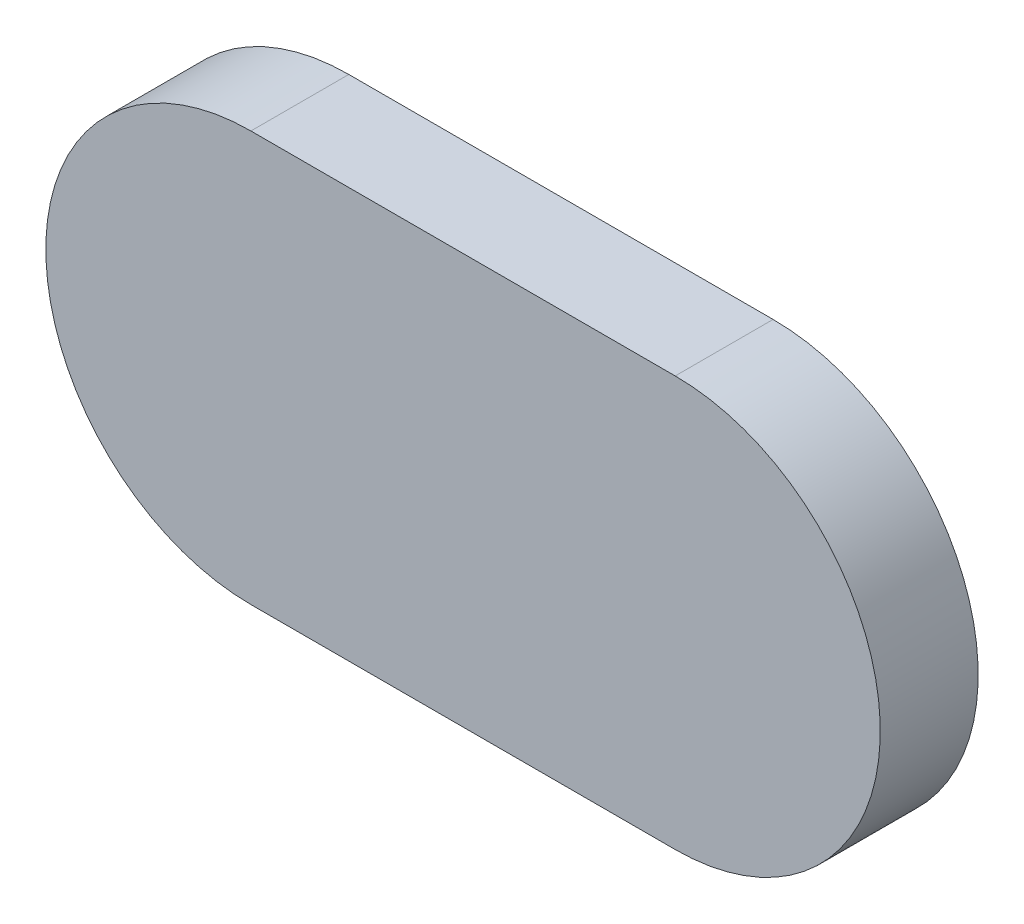
ISO-10303-21;
HEADER;
FILE_DESCRIPTION(('STEP AP214'),'2;1');
FILE_NAME('part.step','',(''),(''),'','','');
FILE_SCHEMA(('AUTOMOTIVE_DESIGN { 1 0 10303 214 1 1 1 1 }'));
ENDSEC;
DATA;
#1=APPLICATION_CONTEXT('core data for automotive mechanical design processes');
#2=APPLICATION_PROTOCOL_DEFINITION('international standard','automotive_design',2000,#1);
#3=PRODUCT_CONTEXT('',#1,'mechanical');
#4=PRODUCT('Part','Part','',(#3));
#5=PRODUCT_RELATED_PRODUCT_CATEGORY('part','',(#4));
#6=PRODUCT_DEFINITION_FORMATION('','',#4);
#7=PRODUCT_DEFINITION_CONTEXT('part definition',#1,'design');
#8=PRODUCT_DEFINITION('design','',#6,#7);
#9=PRODUCT_DEFINITION_SHAPE('','',#8);
#10=(LENGTH_UNIT() NAMED_UNIT(*) SI_UNIT(.MILLI.,.METRE.));
#11=(NAMED_UNIT(*) PLANE_ANGLE_UNIT() SI_UNIT($,.RADIAN.));
#12=(NAMED_UNIT(*) SI_UNIT($,.STERADIAN.) SOLID_ANGLE_UNIT());
#13=UNCERTAINTY_MEASURE_WITH_UNIT(LENGTH_MEASURE(1.E-05),#10,'distance_accuracy_value','');
#14=(GEOMETRIC_REPRESENTATION_CONTEXT(3) GLOBAL_UNCERTAINTY_ASSIGNED_CONTEXT((#13)) GLOBAL_UNIT_ASSIGNED_CONTEXT((#10,
#11,#12)) REPRESENTATION_CONTEXT('',''));
#15=CARTESIAN_POINT('',(0.,0.,0.));
#16=DIRECTION('',(0.,0.,1.));
#17=DIRECTION('',(1.,0.,0.));
#18=AXIS2_PLACEMENT_3D('',#15,#16,#17);
#19=CARTESIAN_POINT('',(-75.,0.904270006017976,0.));
#20=DIRECTION('',(0.,0.,1.));
#21=DIRECTION('',(1.,0.,0.));
#22=AXIS2_PLACEMENT_3D('',#19,#20,#21);
#23=PLANE('',#22);
#24=CARTESIAN_POINT('',(-75.,0.904270006017976,0.));
#25=DIRECTION('',(0.,0.,1.));
#26=DIRECTION('',(1.,0.,0.));
#27=AXIS2_PLACEMENT_3D('',#24,#25,#26);
#28=CIRCLE('',#27,72.5);
#29=CARTESIAN_POINT('',(-75.,73.4042700060163,0.));
#30=VERTEX_POINT('',#29);
#31=CARTESIAN_POINT('',(-75.,-71.595729993982,0.));
#32=VERTEX_POINT('',#31);
#33=EDGE_CURVE('E118',#30,#32,#28,.T.);
#34=ORIENTED_EDGE('',*,*,#33,.F.);
#35=DIRECTION('',(1.,0.,0.));
#36=VECTOR('',#35,1.);
#37=CARTESIAN_POINT('',(-75.,73.4042700060163,0.));
#38=LINE('',#37,#36);
#39=CARTESIAN_POINT('',(75.,73.4042700060163,0.));
#40=VERTEX_POINT('',#39);
#41=EDGE_CURVE('E121',#30,#40,#38,.T.);
#42=ORIENTED_EDGE('',*,*,#41,.T.);
#43=CARTESIAN_POINT('',(75.,0.904270006016422,0.));
#44=DIRECTION('',(0.,0.,1.));
#45=DIRECTION('',(1.,0.,0.));
#46=AXIS2_PLACEMENT_3D('',#43,#44,#45);
#47=CIRCLE('',#46,72.5);
#48=CARTESIAN_POINT('',(75.,-71.5957299939835,0.));
#49=VERTEX_POINT('',#48);
#50=EDGE_CURVE('E119',#49,#40,#47,.T.);
#51=ORIENTED_EDGE('',*,*,#50,.F.);
#52=DIRECTION('',(1.,0.,0.));
#53=VECTOR('',#52,1.);
#54=CARTESIAN_POINT('',(-75.,-71.595729993982,0.));
#55=LINE('',#54,#53);
#56=EDGE_CURVE('E67',#32,#49,#55,.T.);
#57=ORIENTED_EDGE('',*,*,#56,.F.);
#58=EDGE_LOOP('',(#34,#42,#51,#57));
#59=FACE_BOUND('',#58,.T.);
#60=ADVANCED_FACE('F63',(#59),#23,.F.);
#61=CARTESIAN_POINT('',(-75.,0.904270006017976,34.6094334021139));
#62=DIRECTION('',(0.,0.,1.));
#63=DIRECTION('',(1.,0.,0.));
#64=AXIS2_PLACEMENT_3D('',#61,#62,#63);
#65=PLANE('',#64);
#66=CARTESIAN_POINT('',(-75.,0.904270006017976,34.6094334021139));
#67=DIRECTION('',(0.,0.,1.));
#68=DIRECTION('',(1.,0.,0.));
#69=AXIS2_PLACEMENT_3D('',#66,#67,#68);
#70=CIRCLE('',#69,72.5);
#71=CARTESIAN_POINT('',(-75.,73.404270006018,34.6094334021139));
#72=VERTEX_POINT('',#71);
#73=CARTESIAN_POINT('',(-75.,-71.595729993982,34.6094334021139));
#74=VERTEX_POINT('',#73);
#75=EDGE_CURVE('E113',#72,#74,#70,.T.);
#76=ORIENTED_EDGE('',*,*,#75,.T.);
#77=DIRECTION('',(1.,0.,0.));
#78=VECTOR('',#77,1.);
#79=CARTESIAN_POINT('',(-75.,-71.595729993982,34.6094334021139));
#80=LINE('',#79,#78);
#81=CARTESIAN_POINT('',(75.,-71.5957299939835,34.6094334021139));
#82=VERTEX_POINT('',#81);
#83=EDGE_CURVE('E111',#74,#82,#80,.T.);
#84=ORIENTED_EDGE('',*,*,#83,.T.);
#85=CARTESIAN_POINT('',(75.,0.904270006016422,34.6094334021139));
#86=DIRECTION('',(0.,0.,1.));
#87=DIRECTION('',(1.,0.,0.));
#88=AXIS2_PLACEMENT_3D('',#85,#86,#87);
#89=CIRCLE('',#88,72.5);
#90=CARTESIAN_POINT('',(75.,73.4042700060163,34.6094334021139));
#91=VERTEX_POINT('',#90);
#92=EDGE_CURVE('E127',#82,#91,#89,.T.);
#93=ORIENTED_EDGE('',*,*,#92,.T.);
#94=DIRECTION('',(1.,0.,0.));
#95=VECTOR('',#94,1.);
#96=CARTESIAN_POINT('',(-75.,73.4042700060163,34.6094334021139));
#97=LINE('',#96,#95);
#98=EDGE_CURVE('E120',#72,#91,#97,.T.);
#99=ORIENTED_EDGE('',*,*,#98,.F.);
#100=EDGE_LOOP('',(#76,#84,#93,#99));
#101=FACE_BOUND('',#100,.T.);
#102=ADVANCED_FACE('F137',(#101),#65,.T.);
#103=CARTESIAN_POINT('',(-75.,0.904270006017976,34.6094334021139));
#104=DIRECTION('',(0.,0.,-1.));
#105=DIRECTION('',(-1.,0.,0.));
#106=AXIS2_PLACEMENT_3D('',#103,#104,#105);
#107=CYLINDRICAL_SURFACE('',#106,72.5);
#108=ORIENTED_EDGE('',*,*,#75,.F.);
#109=DIRECTION('',(0.,0.,-1.));
#110=VECTOR('',#109,1.);
#111=CARTESIAN_POINT('',(-75.,73.404270006018,34.6094334021139));
#112=LINE('',#111,#110);
#113=EDGE_CURVE('E12',#72,#30,#112,.T.);
#114=ORIENTED_EDGE('',*,*,#113,.T.);
#115=ORIENTED_EDGE('',*,*,#33,.T.);
#116=DIRECTION('',(0.,0.,-1.));
#117=VECTOR('',#116,1.);
#118=CARTESIAN_POINT('',(-75.,-71.595729993982,34.6094334021139));
#119=LINE('',#118,#117);
#120=EDGE_CURVE('E73',#74,#32,#119,.T.);
#121=ORIENTED_EDGE('',*,*,#120,.F.);
#122=EDGE_LOOP('',(#108,#114,#115,#121));
#123=FACE_BOUND('',#122,.T.);
#124=ADVANCED_FACE('F122',(#123),#107,.T.);
#125=CARTESIAN_POINT('',(75.,0.904270006016422,34.6094334021139));
#126=DIRECTION('',(0.,0.,-1.));
#127=DIRECTION('',(-1.,0.,0.));
#128=AXIS2_PLACEMENT_3D('',#125,#126,#127);
#129=CYLINDRICAL_SURFACE('',#128,72.5);
#130=DIRECTION('',(0.,0.,-1.));
#131=VECTOR('',#130,1.);
#132=CARTESIAN_POINT('',(75.,-71.5957299939835,34.6094334021139));
#133=LINE('',#132,#131);
#134=EDGE_CURVE('E104',#49,#82,#133,.F.);
#135=ORIENTED_EDGE('',*,*,#134,.F.);
#136=ORIENTED_EDGE('',*,*,#50,.T.);
#137=DIRECTION('',(0.,0.,-1.));
#138=VECTOR('',#137,1.);
#139=CARTESIAN_POINT('',(75.,73.4042700060163,34.6094334021139));
#140=LINE('',#139,#138);
#141=EDGE_CURVE('E98',#91,#40,#140,.T.);
#142=ORIENTED_EDGE('',*,*,#141,.F.);
#143=ORIENTED_EDGE('',*,*,#92,.F.);
#144=EDGE_LOOP('',(#135,#136,#142,#143));
#145=FACE_BOUND('',#144,.T.);
#146=ADVANCED_FACE('F134',(#145),#129,.T.);
#147=CARTESIAN_POINT('',(-75.,73.4042700060163,34.6094334021139));
#148=DIRECTION('',(0.,1.,0.));
#149=DIRECTION('',(0.,0.,1.));
#150=AXIS2_PLACEMENT_3D('',#147,#148,#149);
#151=PLANE('',#150);
#152=ORIENTED_EDGE('',*,*,#41,.F.);
#153=ORIENTED_EDGE('',*,*,#113,.F.);
#154=ORIENTED_EDGE('',*,*,#98,.T.);
#155=ORIENTED_EDGE('',*,*,#141,.T.);
#156=EDGE_LOOP('',(#152,#153,#154,#155));
#157=FACE_BOUND('',#156,.T.);
#158=ADVANCED_FACE('F65',(#157),#151,.T.);
#159=CARTESIAN_POINT('',(-75.,-71.595729993982,34.6094334021139));
#160=DIRECTION('',(0.,1.,0.));
#161=DIRECTION('',(0.,0.,1.));
#162=AXIS2_PLACEMENT_3D('',#159,#160,#161);
#163=PLANE('',#162);
#164=ORIENTED_EDGE('',*,*,#56,.T.);
#165=ORIENTED_EDGE('',*,*,#134,.T.);
#166=ORIENTED_EDGE('',*,*,#83,.F.);
#167=ORIENTED_EDGE('',*,*,#120,.T.);
#168=EDGE_LOOP('',(#164,#165,#166,#167));
#169=FACE_BOUND('',#168,.T.);
#170=ADVANCED_FACE('F109',(#169),#163,.F.);
#171=CLOSED_SHELL('',(#60,#102,#124,#146,#158,#170));
#172=MANIFOLD_SOLID_BREP('B2',#171);
#173=ADVANCED_BREP_SHAPE_REPRESENTATION('',(#18,#172),#14);
#174=SHAPE_DEFINITION_REPRESENTATION(#9,#173);
ENDSEC;
END-ISO-10303-21;
